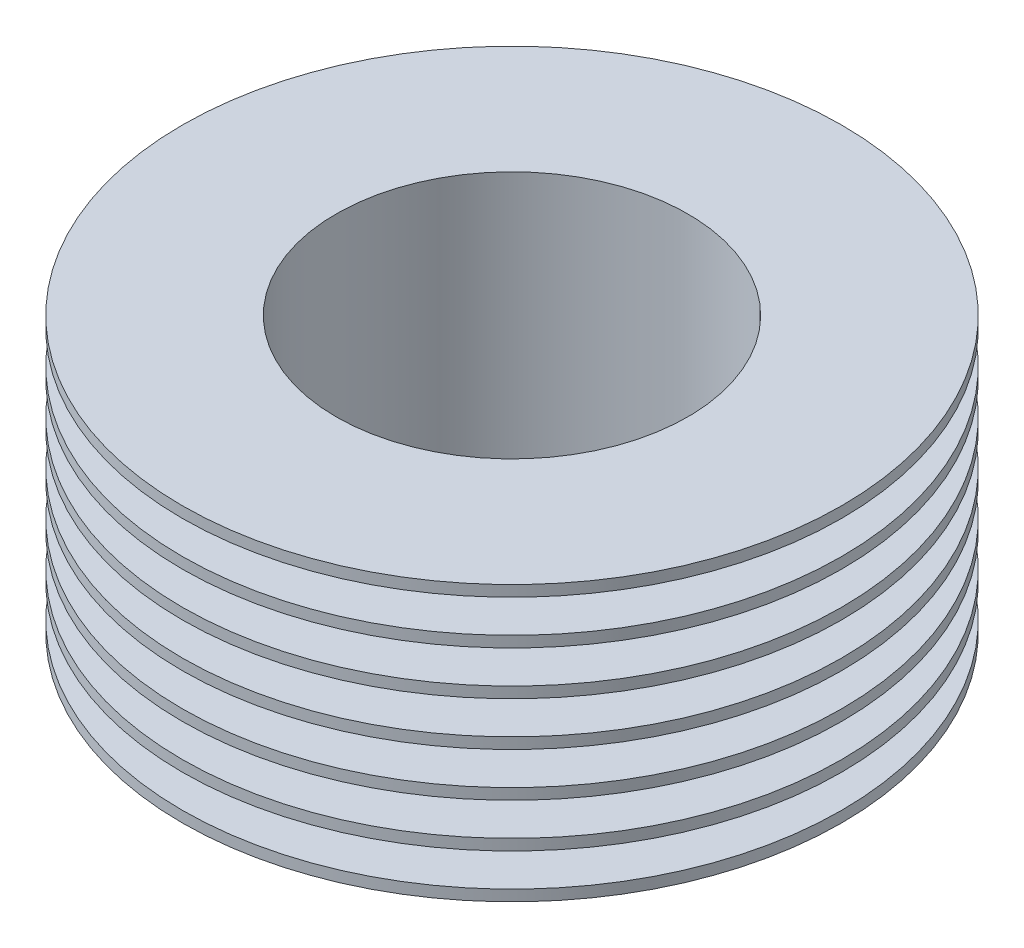
ISO-10303-21;
HEADER;
FILE_DESCRIPTION(('STEP AP214'),'2;1');
FILE_NAME('part.step','',(''),(''),'','','');
FILE_SCHEMA(('AUTOMOTIVE_DESIGN { 1 0 10303 214 1 1 1 1 }'));
ENDSEC;
DATA;
#1=APPLICATION_CONTEXT('core data for automotive mechanical design processes');
#2=APPLICATION_PROTOCOL_DEFINITION('international standard','automotive_design',2000,#1);
#3=PRODUCT_CONTEXT('',#1,'mechanical');
#4=PRODUCT('Part','Part','',(#3));
#5=PRODUCT_RELATED_PRODUCT_CATEGORY('part','',(#4));
#6=PRODUCT_DEFINITION_FORMATION('','',#4);
#7=PRODUCT_DEFINITION_CONTEXT('part definition',#1,'design');
#8=PRODUCT_DEFINITION('design','',#6,#7);
#9=PRODUCT_DEFINITION_SHAPE('','',#8);
#10=(LENGTH_UNIT() NAMED_UNIT(*) SI_UNIT(.MILLI.,.METRE.));
#11=(NAMED_UNIT(*) PLANE_ANGLE_UNIT() SI_UNIT($,.RADIAN.));
#12=(NAMED_UNIT(*) SI_UNIT($,.STERADIAN.) SOLID_ANGLE_UNIT());
#13=UNCERTAINTY_MEASURE_WITH_UNIT(LENGTH_MEASURE(1.E-05),#10,'distance_accuracy_value','');
#14=(GEOMETRIC_REPRESENTATION_CONTEXT(3) GLOBAL_UNCERTAINTY_ASSIGNED_CONTEXT((#13)) GLOBAL_UNIT_ASSIGNED_CONTEXT((#10,
#11,#12)) REPRESENTATION_CONTEXT('',''));
#15=CARTESIAN_POINT('',(0.,0.,0.));
#16=DIRECTION('',(0.,0.,1.));
#17=DIRECTION('',(1.,0.,0.));
#18=AXIS2_PLACEMENT_3D('',#15,#16,#17);
#19=CARTESIAN_POINT('',(0.,28.0586262240942,0.));
#20=DIRECTION('',(0.,1.,0.));
#21=DIRECTION('',(0.,0.,1.));
#22=AXIS2_PLACEMENT_3D('',#19,#20,#21);
#23=CYLINDRICAL_SURFACE('',#22,16.);
#24=CARTESIAN_POINT('',(0.,8.83865887189124,0.));
#25=DIRECTION('',(0.,1.,0.));
#26=DIRECTION('',(0.,0.,1.));
#27=AXIS2_PLACEMENT_3D('',#24,#25,#26);
#28=CIRCLE('',#27,16.);
#29=CARTESIAN_POINT('',(0.,8.83865887189124,16.));
#30=VERTEX_POINT('',#29);
#31=EDGE_CURVE('E82',#30,#30,#28,.T.);
#32=ORIENTED_EDGE('',*,*,#31,.F.);
#33=EDGE_LOOP('',(#32));
#34=FACE_BOUND('',#33,.T.);
#35=CARTESIAN_POINT('',(0.,33.8386588718912,0.));
#36=DIRECTION('',(0.,1.,0.));
#37=DIRECTION('',(0.,0.,1.));
#38=AXIS2_PLACEMENT_3D('',#35,#36,#37);
#39=CIRCLE('',#38,16.);
#40=CARTESIAN_POINT('',(0.,33.8386588718912,16.));
#41=VERTEX_POINT('',#40);
#42=EDGE_CURVE('E123',#41,#41,#39,.T.);
#43=ORIENTED_EDGE('',*,*,#42,.T.);
#44=EDGE_LOOP('',(#43));
#45=FACE_BOUND('',#44,.T.);
#46=ADVANCED_FACE('F34',(#34,#45),#23,.F.);
#47=CARTESIAN_POINT('',(0.,28.0586262240942,0.));
#48=DIRECTION('',(0.,1.,0.));
#49=DIRECTION('',(0.,0.,1.));
#50=AXIS2_PLACEMENT_3D('',#47,#48,#49);
#51=CYLINDRICAL_SURFACE('',#50,18.);
#52=CARTESIAN_POINT('',(0.,12.8386588718912,0.));
#53=DIRECTION('',(0.,-1.,0.));
#54=DIRECTION('',(0.,0.,-1.));
#55=AXIS2_PLACEMENT_3D('',#52,#53,#54);
#56=CIRCLE('',#55,18.);
#57=CARTESIAN_POINT('',(0.,12.8386588718912,-18.));
#58=VERTEX_POINT('',#57);
#59=EDGE_CURVE('E72',#58,#58,#56,.F.);
#60=ORIENTED_EDGE('',*,*,#59,.F.);
#61=EDGE_LOOP('',(#60));
#62=FACE_BOUND('',#61,.T.);
#63=CARTESIAN_POINT('',(0.,9.83865887189124,0.));
#64=DIRECTION('',(0.,1.,0.));
#65=DIRECTION('',(0.,0.,1.));
#66=AXIS2_PLACEMENT_3D('',#63,#64,#65);
#67=CIRCLE('',#66,18.);
#68=CARTESIAN_POINT('',(0.,9.83865887189124,18.));
#69=VERTEX_POINT('',#68);
#70=EDGE_CURVE('E73',#69,#69,#67,.T.);
#71=ORIENTED_EDGE('',*,*,#70,.T.);
#72=EDGE_LOOP('',(#71));
#73=FACE_BOUND('',#72,.T.);
#74=ADVANCED_FACE('F36',(#62,#73),#51,.T.);
#75=CARTESIAN_POINT('',(0.,9.83865887189124,18.));
#76=DIRECTION('',(0.,1.,0.));
#77=DIRECTION('',(0.,0.,1.));
#78=AXIS2_PLACEMENT_3D('',#75,#76,#77);
#79=PLANE('',#78);
#80=CARTESIAN_POINT('',(0.,9.83865887189124,0.));
#81=DIRECTION('',(0.,1.,0.));
#82=DIRECTION('',(0.,0.,1.));
#83=AXIS2_PLACEMENT_3D('',#80,#81,#82);
#84=CIRCLE('',#83,30.);
#85=CARTESIAN_POINT('',(0.,9.83865887189124,30.));
#86=VERTEX_POINT('',#85);
#87=EDGE_CURVE('E76',#86,#86,#84,.T.);
#88=ORIENTED_EDGE('',*,*,#87,.T.);
#89=EDGE_LOOP('',(#88));
#90=FACE_BOUND('',#89,.T.);
#91=ORIENTED_EDGE('',*,*,#70,.F.);
#92=EDGE_LOOP('',(#91));
#93=FACE_BOUND('',#92,.T.);
#94=ADVANCED_FACE('F151',(#90,#93),#79,.T.);
#95=CARTESIAN_POINT('',(0.,28.0586262240942,0.));
#96=DIRECTION('',(0.,1.,0.));
#97=DIRECTION('',(0.,0.,1.));
#98=AXIS2_PLACEMENT_3D('',#95,#96,#97);
#99=CYLINDRICAL_SURFACE('',#98,30.);
#100=CARTESIAN_POINT('',(0.,8.83865887189124,0.));
#101=DIRECTION('',(0.,1.,0.));
#102=DIRECTION('',(0.,0.,1.));
#103=AXIS2_PLACEMENT_3D('',#100,#101,#102);
#104=CIRCLE('',#103,30.);
#105=CARTESIAN_POINT('',(0.,8.83865887189124,30.));
#106=VERTEX_POINT('',#105);
#107=EDGE_CURVE('E79',#106,#106,#104,.T.);
#108=ORIENTED_EDGE('',*,*,#107,.T.);
#109=EDGE_LOOP('',(#108));
#110=FACE_BOUND('',#109,.T.);
#111=ORIENTED_EDGE('',*,*,#87,.F.);
#112=EDGE_LOOP('',(#111));
#113=FACE_BOUND('',#112,.T.);
#114=ADVANCED_FACE('F162',(#110,#113),#99,.T.);
#115=CARTESIAN_POINT('',(0.,8.83865887189124,30.));
#116=DIRECTION('',(0.,-1.,0.));
#117=DIRECTION('',(0.,0.,-1.));
#118=AXIS2_PLACEMENT_3D('',#115,#116,#117);
#119=PLANE('',#118);
#120=ORIENTED_EDGE('',*,*,#31,.T.);
#121=EDGE_LOOP('',(#120));
#122=FACE_BOUND('',#121,.T.);
#123=ORIENTED_EDGE('',*,*,#107,.F.);
#124=EDGE_LOOP('',(#123));
#125=FACE_BOUND('',#124,.T.);
#126=ADVANCED_FACE('F159',(#122,#125),#119,.T.);
#127=CARTESIAN_POINT('',(0.,13.8386588718912,18.));
#128=DIRECTION('',(0.,1.,0.));
#129=DIRECTION('',(0.,0.,1.));
#130=AXIS2_PLACEMENT_3D('',#127,#128,#129);
#131=PLANE('',#130);
#132=CARTESIAN_POINT('',(0.,13.8386588718912,0.));
#133=DIRECTION('',(0.,1.,0.));
#134=DIRECTION('',(0.,0.,1.));
#135=AXIS2_PLACEMENT_3D('',#132,#133,#134);
#136=CIRCLE('',#135,30.);
#137=CARTESIAN_POINT('',(0.,13.8386588718912,30.));
#138=VERTEX_POINT('',#137);
#139=EDGE_CURVE('E85',#138,#138,#136,.T.);
#140=ORIENTED_EDGE('',*,*,#139,.T.);
#141=EDGE_LOOP('',(#140));
#142=FACE_BOUND('',#141,.T.);
#143=CARTESIAN_POINT('',(0.,13.8386588718912,0.));
#144=DIRECTION('',(0.,1.,0.));
#145=DIRECTION('',(0.,0.,1.));
#146=AXIS2_PLACEMENT_3D('',#143,#144,#145);
#147=CIRCLE('',#146,18.);
#148=CARTESIAN_POINT('',(0.,13.8386588718912,18.));
#149=VERTEX_POINT('',#148);
#150=EDGE_CURVE('E69',#149,#149,#147,.F.);
#151=ORIENTED_EDGE('',*,*,#150,.T.);
#152=EDGE_LOOP('',(#151));
#153=FACE_BOUND('',#152,.T.);
#154=ADVANCED_FACE('F157',(#142,#153),#131,.T.);
#155=CARTESIAN_POINT('',(0.,32.0586262240942,0.));
#156=DIRECTION('',(0.,1.,0.));
#157=DIRECTION('',(0.,0.,1.));
#158=AXIS2_PLACEMENT_3D('',#155,#156,#157);
#159=CYLINDRICAL_SURFACE('',#158,30.);
#160=CARTESIAN_POINT('',(0.,12.8386588718912,0.));
#161=DIRECTION('',(0.,1.,0.));
#162=DIRECTION('',(0.,0.,1.));
#163=AXIS2_PLACEMENT_3D('',#160,#161,#162);
#164=CIRCLE('',#163,30.);
#165=CARTESIAN_POINT('',(0.,12.8386588718912,30.));
#166=VERTEX_POINT('',#165);
#167=EDGE_CURVE('E90',#166,#166,#164,.T.);
#168=ORIENTED_EDGE('',*,*,#167,.T.);
#169=EDGE_LOOP('',(#168));
#170=FACE_BOUND('',#169,.T.);
#171=ORIENTED_EDGE('',*,*,#139,.F.);
#172=EDGE_LOOP('',(#171));
#173=FACE_BOUND('',#172,.T.);
#174=ADVANCED_FACE('F191',(#170,#173),#159,.T.);
#175=CARTESIAN_POINT('',(0.,12.8386588718912,30.));
#176=DIRECTION('',(0.,-1.,0.));
#177=DIRECTION('',(0.,0.,-1.));
#178=AXIS2_PLACEMENT_3D('',#175,#176,#177);
#179=PLANE('',#178);
#180=ORIENTED_EDGE('',*,*,#59,.T.);
#181=EDGE_LOOP('',(#180));
#182=FACE_BOUND('',#181,.T.);
#183=ORIENTED_EDGE('',*,*,#167,.F.);
#184=EDGE_LOOP('',(#183));
#185=FACE_BOUND('',#184,.T.);
#186=ADVANCED_FACE('F198',(#182,#185),#179,.T.);
#187=CARTESIAN_POINT('',(0.,16.8386588718912,0.));
#188=DIRECTION('',(0.,-1.,0.));
#189=DIRECTION('',(0.,0.,-1.));
#190=AXIS2_PLACEMENT_3D('',#187,#188,#189);
#191=CIRCLE('',#190,18.);
#192=CARTESIAN_POINT('',(0.,16.8386588718912,-18.));
#193=VERTEX_POINT('',#192);
#194=EDGE_CURVE('E66',#193,#193,#191,.F.);
#195=ORIENTED_EDGE('',*,*,#194,.F.);
#196=EDGE_LOOP('',(#195));
#197=FACE_BOUND('',#196,.T.);
#198=ORIENTED_EDGE('',*,*,#150,.F.);
#199=EDGE_LOOP('',(#198));
#200=FACE_BOUND('',#199,.T.);
#201=ADVANCED_FACE('F153',(#197,#200),#51,.T.);
#202=CARTESIAN_POINT('',(0.,20.8386588718912,0.));
#203=DIRECTION('',(0.,-1.,0.));
#204=DIRECTION('',(0.,0.,-1.));
#205=AXIS2_PLACEMENT_3D('',#202,#203,#204);
#206=CIRCLE('',#205,18.);
#207=CARTESIAN_POINT('',(0.,20.8386588718912,-18.));
#208=VERTEX_POINT('',#207);
#209=EDGE_CURVE('E60',#208,#208,#206,.F.);
#210=ORIENTED_EDGE('',*,*,#209,.F.);
#211=EDGE_LOOP('',(#210));
#212=FACE_BOUND('',#211,.T.);
#213=CARTESIAN_POINT('',(0.,17.8386588718912,0.));
#214=DIRECTION('',(0.,1.,0.));
#215=DIRECTION('',(0.,0.,1.));
#216=AXIS2_PLACEMENT_3D('',#213,#214,#215);
#217=CIRCLE('',#216,18.);
#218=CARTESIAN_POINT('',(0.,17.8386588718912,18.));
#219=VERTEX_POINT('',#218);
#220=EDGE_CURVE('E63',#219,#219,#217,.F.);
#221=ORIENTED_EDGE('',*,*,#220,.F.);
#222=EDGE_LOOP('',(#221));
#223=FACE_BOUND('',#222,.T.);
#224=ADVANCED_FACE('F212',(#212,#223),#51,.T.);
#225=CARTESIAN_POINT('',(0.,17.8386588718912,18.));
#226=DIRECTION('',(0.,1.,0.));
#227=DIRECTION('',(0.,0.,1.));
#228=AXIS2_PLACEMENT_3D('',#225,#226,#227);
#229=PLANE('',#228);
#230=CARTESIAN_POINT('',(0.,17.8386588718912,0.));
#231=DIRECTION('',(0.,1.,0.));
#232=DIRECTION('',(0.,0.,1.));
#233=AXIS2_PLACEMENT_3D('',#230,#231,#232);
#234=CIRCLE('',#233,30.);
#235=CARTESIAN_POINT('',(0.,17.8386588718912,30.));
#236=VERTEX_POINT('',#235);
#237=EDGE_CURVE('E93',#236,#236,#234,.T.);
#238=ORIENTED_EDGE('',*,*,#237,.T.);
#239=EDGE_LOOP('',(#238));
#240=FACE_BOUND('',#239,.T.);
#241=ORIENTED_EDGE('',*,*,#220,.T.);
#242=EDGE_LOOP('',(#241));
#243=FACE_BOUND('',#242,.T.);
#244=ADVANCED_FACE('F219',(#240,#243),#229,.T.);
#245=CARTESIAN_POINT('',(0.,36.0586262240942,0.));
#246=DIRECTION('',(0.,1.,0.));
#247=DIRECTION('',(0.,0.,1.));
#248=AXIS2_PLACEMENT_3D('',#245,#246,#247);
#249=CYLINDRICAL_SURFACE('',#248,30.);
#250=CARTESIAN_POINT('',(0.,16.8386588718912,0.));
#251=DIRECTION('',(0.,1.,0.));
#252=DIRECTION('',(0.,0.,1.));
#253=AXIS2_PLACEMENT_3D('',#250,#251,#252);
#254=CIRCLE('',#253,30.);
#255=CARTESIAN_POINT('',(0.,16.8386588718912,30.));
#256=VERTEX_POINT('',#255);
#257=EDGE_CURVE('E96',#256,#256,#254,.T.);
#258=ORIENTED_EDGE('',*,*,#257,.T.);
#259=EDGE_LOOP('',(#258));
#260=FACE_BOUND('',#259,.T.);
#261=ORIENTED_EDGE('',*,*,#237,.F.);
#262=EDGE_LOOP('',(#261));
#263=FACE_BOUND('',#262,.T.);
#264=ADVANCED_FACE('F227',(#260,#263),#249,.T.);
#265=CARTESIAN_POINT('',(0.,16.8386588718912,30.));
#266=DIRECTION('',(0.,-1.,0.));
#267=DIRECTION('',(0.,0.,-1.));
#268=AXIS2_PLACEMENT_3D('',#265,#266,#267);
#269=PLANE('',#268);
#270=ORIENTED_EDGE('',*,*,#194,.T.);
#271=EDGE_LOOP('',(#270));
#272=FACE_BOUND('',#271,.T.);
#273=ORIENTED_EDGE('',*,*,#257,.F.);
#274=EDGE_LOOP('',(#273));
#275=FACE_BOUND('',#274,.T.);
#276=ADVANCED_FACE('F235',(#272,#275),#269,.T.);
#277=CARTESIAN_POINT('',(0.,21.8386588718912,18.));
#278=DIRECTION('',(0.,1.,0.));
#279=DIRECTION('',(0.,0.,1.));
#280=AXIS2_PLACEMENT_3D('',#277,#278,#279);
#281=PLANE('',#280);
#282=CARTESIAN_POINT('',(0.,21.8386588718912,0.));
#283=DIRECTION('',(0.,1.,0.));
#284=DIRECTION('',(0.,0.,1.));
#285=AXIS2_PLACEMENT_3D('',#282,#283,#284);
#286=CIRCLE('',#285,30.);
#287=CARTESIAN_POINT('',(0.,21.8386588718912,30.));
#288=VERTEX_POINT('',#287);
#289=EDGE_CURVE('E99',#288,#288,#286,.T.);
#290=ORIENTED_EDGE('',*,*,#289,.T.);
#291=EDGE_LOOP('',(#290));
#292=FACE_BOUND('',#291,.T.);
#293=CARTESIAN_POINT('',(0.,21.8386588718912,0.));
#294=DIRECTION('',(0.,1.,0.));
#295=DIRECTION('',(0.,0.,1.));
#296=AXIS2_PLACEMENT_3D('',#293,#294,#295);
#297=CIRCLE('',#296,18.);
#298=CARTESIAN_POINT('',(0.,21.8386588718912,18.));
#299=VERTEX_POINT('',#298);
#300=EDGE_CURVE('E57',#299,#299,#297,.F.);
#301=ORIENTED_EDGE('',*,*,#300,.T.);
#302=EDGE_LOOP('',(#301));
#303=FACE_BOUND('',#302,.T.);
#304=ADVANCED_FACE('F243',(#292,#303),#281,.T.);
#305=CARTESIAN_POINT('',(0.,40.0586262240942,0.));
#306=DIRECTION('',(0.,1.,0.));
#307=DIRECTION('',(0.,0.,1.));
#308=AXIS2_PLACEMENT_3D('',#305,#306,#307);
#309=CYLINDRICAL_SURFACE('',#308,30.);
#310=CARTESIAN_POINT('',(0.,20.8386588718912,0.));
#311=DIRECTION('',(0.,1.,0.));
#312=DIRECTION('',(0.,0.,1.));
#313=AXIS2_PLACEMENT_3D('',#310,#311,#312);
#314=CIRCLE('',#313,30.);
#315=CARTESIAN_POINT('',(0.,20.8386588718912,30.));
#316=VERTEX_POINT('',#315);
#317=EDGE_CURVE('E102',#316,#316,#314,.T.);
#318=ORIENTED_EDGE('',*,*,#317,.T.);
#319=EDGE_LOOP('',(#318));
#320=FACE_BOUND('',#319,.T.);
#321=ORIENTED_EDGE('',*,*,#289,.F.);
#322=EDGE_LOOP('',(#321));
#323=FACE_BOUND('',#322,.T.);
#324=ADVANCED_FACE('F251',(#320,#323),#309,.T.);
#325=CARTESIAN_POINT('',(0.,20.8386588718912,30.));
#326=DIRECTION('',(0.,-1.,0.));
#327=DIRECTION('',(0.,0.,-1.));
#328=AXIS2_PLACEMENT_3D('',#325,#326,#327);
#329=PLANE('',#328);
#330=ORIENTED_EDGE('',*,*,#209,.T.);
#331=EDGE_LOOP('',(#330));
#332=FACE_BOUND('',#331,.T.);
#333=ORIENTED_EDGE('',*,*,#317,.F.);
#334=EDGE_LOOP('',(#333));
#335=FACE_BOUND('',#334,.T.);
#336=ADVANCED_FACE('F259',(#332,#335),#329,.T.);
#337=CARTESIAN_POINT('',(0.,24.8386588718912,0.));
#338=DIRECTION('',(0.,-1.,0.));
#339=DIRECTION('',(0.,0.,-1.));
#340=AXIS2_PLACEMENT_3D('',#337,#338,#339);
#341=CIRCLE('',#340,18.);
#342=CARTESIAN_POINT('',(0.,24.8386588718912,-18.));
#343=VERTEX_POINT('',#342);
#344=EDGE_CURVE('E54',#343,#343,#341,.F.);
#345=ORIENTED_EDGE('',*,*,#344,.F.);
#346=EDGE_LOOP('',(#345));
#347=FACE_BOUND('',#346,.T.);
#348=ORIENTED_EDGE('',*,*,#300,.F.);
#349=EDGE_LOOP('',(#348));
#350=FACE_BOUND('',#349,.T.);
#351=ADVANCED_FACE('F221',(#347,#350),#51,.T.);
#352=CARTESIAN_POINT('',(0.,28.8386588718912,0.));
#353=DIRECTION('',(0.,-1.,0.));
#354=DIRECTION('',(0.,0.,-1.));
#355=AXIS2_PLACEMENT_3D('',#352,#353,#354);
#356=CIRCLE('',#355,18.);
#357=CARTESIAN_POINT('',(0.,28.8386588718912,-18.));
#358=VERTEX_POINT('',#357);
#359=EDGE_CURVE('E45',#358,#358,#356,.F.);
#360=ORIENTED_EDGE('',*,*,#359,.F.);
#361=EDGE_LOOP('',(#360));
#362=FACE_BOUND('',#361,.T.);
#363=CARTESIAN_POINT('',(0.,25.8386588718912,0.));
#364=DIRECTION('',(0.,1.,0.));
#365=DIRECTION('',(0.,0.,1.));
#366=AXIS2_PLACEMENT_3D('',#363,#364,#365);
#367=CIRCLE('',#366,18.);
#368=CARTESIAN_POINT('',(0.,25.8386588718912,18.));
#369=VERTEX_POINT('',#368);
#370=EDGE_CURVE('E49',#369,#369,#367,.F.);
#371=ORIENTED_EDGE('',*,*,#370,.F.);
#372=EDGE_LOOP('',(#371));
#373=FACE_BOUND('',#372,.T.);
#374=ADVANCED_FACE('F143',(#362,#373),#51,.T.);
#375=CARTESIAN_POINT('',(0.,25.8386588718912,18.));
#376=DIRECTION('',(0.,1.,0.));
#377=DIRECTION('',(0.,0.,1.));
#378=AXIS2_PLACEMENT_3D('',#375,#376,#377);
#379=PLANE('',#378);
#380=CARTESIAN_POINT('',(0.,25.8386588718912,0.));
#381=DIRECTION('',(0.,1.,0.));
#382=DIRECTION('',(0.,0.,1.));
#383=AXIS2_PLACEMENT_3D('',#380,#381,#382);
#384=CIRCLE('',#383,30.);
#385=CARTESIAN_POINT('',(0.,25.8386588718912,30.));
#386=VERTEX_POINT('',#385);
#387=EDGE_CURVE('E105',#386,#386,#384,.T.);
#388=ORIENTED_EDGE('',*,*,#387,.T.);
#389=EDGE_LOOP('',(#388));
#390=FACE_BOUND('',#389,.T.);
#391=ORIENTED_EDGE('',*,*,#370,.T.);
#392=EDGE_LOOP('',(#391));
#393=FACE_BOUND('',#392,.T.);
#394=ADVANCED_FACE('F280',(#390,#393),#379,.T.);
#395=CARTESIAN_POINT('',(0.,44.0586262240942,0.));
#396=DIRECTION('',(0.,1.,0.));
#397=DIRECTION('',(0.,0.,1.));
#398=AXIS2_PLACEMENT_3D('',#395,#396,#397);
#399=CYLINDRICAL_SURFACE('',#398,30.);
#400=CARTESIAN_POINT('',(0.,24.8386588718912,0.));
#401=DIRECTION('',(0.,1.,0.));
#402=DIRECTION('',(0.,0.,1.));
#403=AXIS2_PLACEMENT_3D('',#400,#401,#402);
#404=CIRCLE('',#403,30.);
#405=CARTESIAN_POINT('',(0.,24.8386588718912,30.));
#406=VERTEX_POINT('',#405);
#407=EDGE_CURVE('E108',#406,#406,#404,.T.);
#408=ORIENTED_EDGE('',*,*,#407,.T.);
#409=EDGE_LOOP('',(#408));
#410=FACE_BOUND('',#409,.T.);
#411=ORIENTED_EDGE('',*,*,#387,.F.);
#412=EDGE_LOOP('',(#411));
#413=FACE_BOUND('',#412,.T.);
#414=ADVANCED_FACE('F287',(#410,#413),#399,.T.);
#415=CARTESIAN_POINT('',(0.,24.8386588718912,30.));
#416=DIRECTION('',(0.,-1.,0.));
#417=DIRECTION('',(0.,0.,-1.));
#418=AXIS2_PLACEMENT_3D('',#415,#416,#417);
#419=PLANE('',#418);
#420=ORIENTED_EDGE('',*,*,#344,.T.);
#421=EDGE_LOOP('',(#420));
#422=FACE_BOUND('',#421,.T.);
#423=ORIENTED_EDGE('',*,*,#407,.F.);
#424=EDGE_LOOP('',(#423));
#425=FACE_BOUND('',#424,.T.);
#426=ADVANCED_FACE('F295',(#422,#425),#419,.T.);
#427=CARTESIAN_POINT('',(0.,29.8386588718912,18.));
#428=DIRECTION('',(0.,1.,0.));
#429=DIRECTION('',(0.,0.,1.));
#430=AXIS2_PLACEMENT_3D('',#427,#428,#429);
#431=PLANE('',#430);
#432=CARTESIAN_POINT('',(0.,29.8386588718912,0.));
#433=DIRECTION('',(0.,1.,0.));
#434=DIRECTION('',(0.,0.,1.));
#435=AXIS2_PLACEMENT_3D('',#432,#433,#434);
#436=CIRCLE('',#435,30.);
#437=CARTESIAN_POINT('',(0.,29.8386588718912,30.));
#438=VERTEX_POINT('',#437);
#439=EDGE_CURVE('E111',#438,#438,#436,.T.);
#440=ORIENTED_EDGE('',*,*,#439,.T.);
#441=EDGE_LOOP('',(#440));
#442=FACE_BOUND('',#441,.T.);
#443=CARTESIAN_POINT('',(0.,29.8386588718912,0.));
#444=DIRECTION('',(0.,1.,0.));
#445=DIRECTION('',(0.,0.,1.));
#446=AXIS2_PLACEMENT_3D('',#443,#444,#445);
#447=CIRCLE('',#446,18.);
#448=CARTESIAN_POINT('',(0.,29.8386588718912,18.));
#449=VERTEX_POINT('',#448);
#450=EDGE_CURVE('E41',#449,#449,#447,.F.);
#451=ORIENTED_EDGE('',*,*,#450,.T.);
#452=EDGE_LOOP('',(#451));
#453=FACE_BOUND('',#452,.T.);
#454=ADVANCED_FACE('F303',(#442,#453),#431,.T.);
#455=CARTESIAN_POINT('',(0.,48.0586262240942,0.));
#456=DIRECTION('',(0.,1.,0.));
#457=DIRECTION('',(0.,0.,1.));
#458=AXIS2_PLACEMENT_3D('',#455,#456,#457);
#459=CYLINDRICAL_SURFACE('',#458,30.);
#460=CARTESIAN_POINT('',(0.,28.8386588718912,0.));
#461=DIRECTION('',(0.,1.,0.));
#462=DIRECTION('',(0.,0.,1.));
#463=AXIS2_PLACEMENT_3D('',#460,#461,#462);
#464=CIRCLE('',#463,30.);
#465=CARTESIAN_POINT('',(0.,28.8386588718912,30.));
#466=VERTEX_POINT('',#465);
#467=EDGE_CURVE('E114',#466,#466,#464,.T.);
#468=ORIENTED_EDGE('',*,*,#467,.T.);
#469=EDGE_LOOP('',(#468));
#470=FACE_BOUND('',#469,.T.);
#471=ORIENTED_EDGE('',*,*,#439,.F.);
#472=EDGE_LOOP('',(#471));
#473=FACE_BOUND('',#472,.T.);
#474=ADVANCED_FACE('F311',(#470,#473),#459,.T.);
#475=CARTESIAN_POINT('',(0.,28.8386588718912,30.));
#476=DIRECTION('',(0.,-1.,0.));
#477=DIRECTION('',(0.,0.,-1.));
#478=AXIS2_PLACEMENT_3D('',#475,#476,#477);
#479=PLANE('',#478);
#480=ORIENTED_EDGE('',*,*,#359,.T.);
#481=EDGE_LOOP('',(#480));
#482=FACE_BOUND('',#481,.T.);
#483=ORIENTED_EDGE('',*,*,#467,.F.);
#484=EDGE_LOOP('',(#483));
#485=FACE_BOUND('',#484,.T.);
#486=ADVANCED_FACE('F141',(#482,#485),#479,.T.);
#487=CARTESIAN_POINT('',(0.,32.8386588718912,0.));
#488=DIRECTION('',(0.,-1.,0.));
#489=DIRECTION('',(0.,0.,-1.));
#490=AXIS2_PLACEMENT_3D('',#487,#488,#489);
#491=CIRCLE('',#490,18.);
#492=CARTESIAN_POINT('',(0.,32.8386588718912,-18.));
#493=VERTEX_POINT('',#492);
#494=EDGE_CURVE('E10',#493,#493,#491,.F.);
#495=ORIENTED_EDGE('',*,*,#494,.F.);
#496=EDGE_LOOP('',(#495));
#497=FACE_BOUND('',#496,.T.);
#498=ORIENTED_EDGE('',*,*,#450,.F.);
#499=EDGE_LOOP('',(#498));
#500=FACE_BOUND('',#499,.T.);
#501=ADVANCED_FACE('F131',(#497,#500),#51,.T.);
#502=CARTESIAN_POINT('',(0.,33.8386588718912,18.));
#503=DIRECTION('',(0.,1.,0.));
#504=DIRECTION('',(0.,0.,1.));
#505=AXIS2_PLACEMENT_3D('',#502,#503,#504);
#506=PLANE('',#505);
#507=CARTESIAN_POINT('',(0.,33.8386588718912,0.));
#508=DIRECTION('',(0.,1.,0.));
#509=DIRECTION('',(0.,0.,1.));
#510=AXIS2_PLACEMENT_3D('',#507,#508,#509);
#511=CIRCLE('',#510,30.);
#512=CARTESIAN_POINT('',(0.,33.8386588718912,30.));
#513=VERTEX_POINT('',#512);
#514=EDGE_CURVE('E117',#513,#513,#511,.T.);
#515=ORIENTED_EDGE('',*,*,#514,.T.);
#516=EDGE_LOOP('',(#515));
#517=FACE_BOUND('',#516,.T.);
#518=ORIENTED_EDGE('',*,*,#42,.F.);
#519=EDGE_LOOP('',(#518));
#520=FACE_BOUND('',#519,.T.);
#521=ADVANCED_FACE('F128',(#517,#520),#506,.T.);
#522=CARTESIAN_POINT('',(0.,52.0586262240942,0.));
#523=DIRECTION('',(0.,1.,0.));
#524=DIRECTION('',(0.,0.,1.));
#525=AXIS2_PLACEMENT_3D('',#522,#523,#524);
#526=CYLINDRICAL_SURFACE('',#525,30.);
#527=CARTESIAN_POINT('',(0.,32.8386588718912,0.));
#528=DIRECTION('',(0.,1.,0.));
#529=DIRECTION('',(0.,0.,1.));
#530=AXIS2_PLACEMENT_3D('',#527,#528,#529);
#531=CIRCLE('',#530,30.);
#532=CARTESIAN_POINT('',(0.,32.8386588718912,30.));
#533=VERTEX_POINT('',#532);
#534=EDGE_CURVE('E120',#533,#533,#531,.T.);
#535=ORIENTED_EDGE('',*,*,#534,.T.);
#536=EDGE_LOOP('',(#535));
#537=FACE_BOUND('',#536,.T.);
#538=ORIENTED_EDGE('',*,*,#514,.F.);
#539=EDGE_LOOP('',(#538));
#540=FACE_BOUND('',#539,.T.);
#541=ADVANCED_FACE('F130',(#537,#540),#526,.T.);
#542=CARTESIAN_POINT('',(0.,32.8386588718912,30.));
#543=DIRECTION('',(0.,-1.,0.));
#544=DIRECTION('',(0.,0.,-1.));
#545=AXIS2_PLACEMENT_3D('',#542,#543,#544);
#546=PLANE('',#545);
#547=ORIENTED_EDGE('',*,*,#494,.T.);
#548=EDGE_LOOP('',(#547));
#549=FACE_BOUND('',#548,.T.);
#550=ORIENTED_EDGE('',*,*,#534,.F.);
#551=EDGE_LOOP('',(#550));
#552=FACE_BOUND('',#551,.T.);
#553=ADVANCED_FACE('F138',(#549,#552),#546,.T.);
#554=CLOSED_SHELL('',(#46,#74,#94,#114,#126,#154,#174,#186,#201,#224,#244,#264,#276,#304,#324,
#336,#351,#374,#394,#414,#426,#454,#474,#486,#501,#521,#541,#553));
#555=MANIFOLD_SOLID_BREP('B2',#554);
#556=ADVANCED_BREP_SHAPE_REPRESENTATION('',(#18,#555),#14);
#557=SHAPE_DEFINITION_REPRESENTATION(#9,#556);
ENDSEC;
END-ISO-10303-21;
